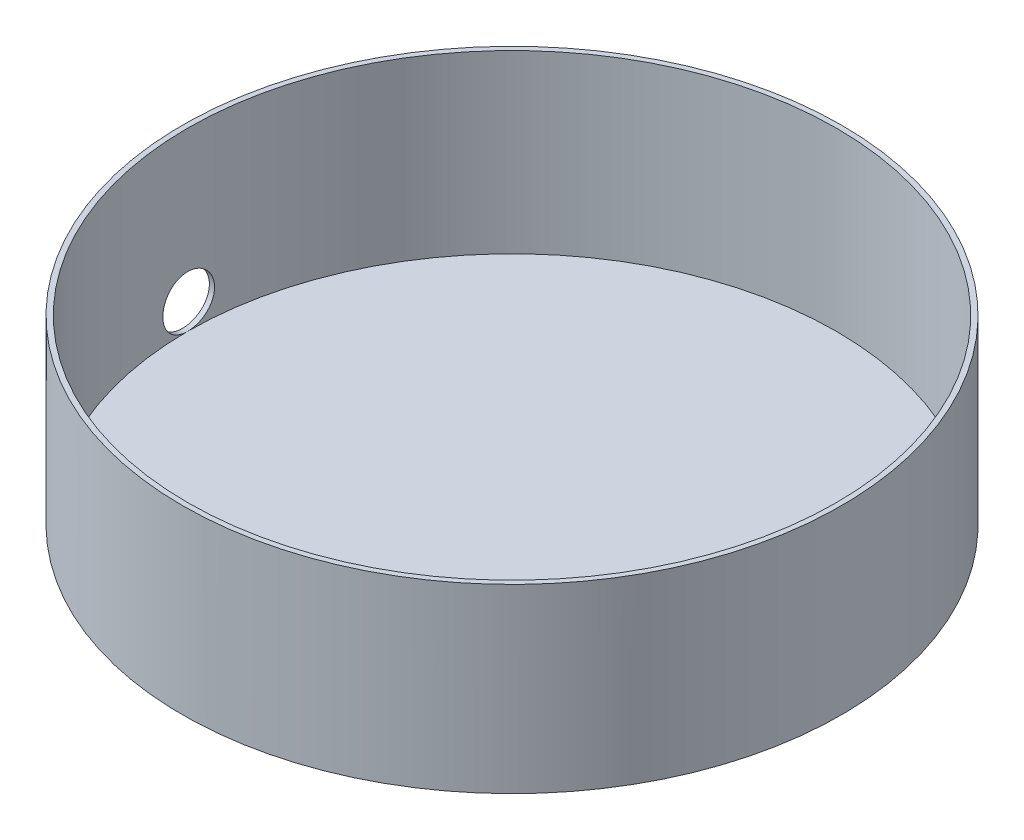
ISO-10303-21;
HEADER;
FILE_DESCRIPTION(('STEP AP214'),'2;1');
FILE_NAME('part.step','',(''),(''),'','','');
FILE_SCHEMA(('AUTOMOTIVE_DESIGN { 1 0 10303 214 1 1 1 1 }'));
ENDSEC;
DATA;
#1=APPLICATION_CONTEXT('core data for automotive mechanical design processes');
#2=APPLICATION_PROTOCOL_DEFINITION('international standard','automotive_design',2000,#1);
#3=PRODUCT_CONTEXT('',#1,'mechanical');
#4=PRODUCT('Part','Part','',(#3));
#5=PRODUCT_RELATED_PRODUCT_CATEGORY('part','',(#4));
#6=PRODUCT_DEFINITION_FORMATION('','',#4);
#7=PRODUCT_DEFINITION_CONTEXT('part definition',#1,'design');
#8=PRODUCT_DEFINITION('design','',#6,#7);
#9=PRODUCT_DEFINITION_SHAPE('','',#8);
#10=(LENGTH_UNIT() NAMED_UNIT(*) SI_UNIT(.MILLI.,.METRE.));
#11=(NAMED_UNIT(*) PLANE_ANGLE_UNIT() SI_UNIT($,.RADIAN.));
#12=(NAMED_UNIT(*) SI_UNIT($,.STERADIAN.) SOLID_ANGLE_UNIT());
#13=UNCERTAINTY_MEASURE_WITH_UNIT(LENGTH_MEASURE(1.E-05),#10,'distance_accuracy_value','');
#14=(GEOMETRIC_REPRESENTATION_CONTEXT(3) GLOBAL_UNCERTAINTY_ASSIGNED_CONTEXT((#13)) GLOBAL_UNIT_ASSIGNED_CONTEXT((#10,
#11,#12)) REPRESENTATION_CONTEXT('',''));
#15=CARTESIAN_POINT('',(0.,0.,0.));
#16=DIRECTION('',(0.,0.,1.));
#17=DIRECTION('',(1.,0.,0.));
#18=AXIS2_PLACEMENT_3D('',#15,#16,#17);
#19=CARTESIAN_POINT('',(0.,68.,0.));
#20=DIRECTION('',(0.,1.,0.));
#21=DIRECTION('',(0.,0.,1.));
#22=AXIS2_PLACEMENT_3D('',#19,#20,#21);
#23=PLANE('',#22);
#24=CARTESIAN_POINT('',(0.,68.,0.));
#25=DIRECTION('',(0.,1.,0.));
#26=DIRECTION('',(0.,0.,1.));
#27=AXIS2_PLACEMENT_3D('',#24,#25,#26);
#28=CIRCLE('',#27,127.3);
#29=CARTESIAN_POINT('',(0.,68.,127.3));
#30=VERTEX_POINT('',#29);
#31=EDGE_CURVE('E11',#30,#30,#28,.T.);
#32=ORIENTED_EDGE('',*,*,#31,.T.);
#33=EDGE_LOOP('',(#32));
#34=FACE_BOUND('',#33,.T.);
#35=CARTESIAN_POINT('',(0.,68.,0.));
#36=DIRECTION('',(0.,1.,0.));
#37=DIRECTION('',(0.,0.,1.));
#38=AXIS2_PLACEMENT_3D('',#35,#36,#37);
#39=CIRCLE('',#38,125.3);
#40=CARTESIAN_POINT('',(0.,68.,125.3));
#41=VERTEX_POINT('',#40);
#42=EDGE_CURVE('E52',#41,#41,#39,.T.);
#43=ORIENTED_EDGE('',*,*,#42,.F.);
#44=EDGE_LOOP('',(#43));
#45=FACE_BOUND('',#44,.T.);
#46=ADVANCED_FACE('F43',(#34,#45),#23,.T.);
#47=CARTESIAN_POINT('',(0.,68.,0.));
#48=DIRECTION('',(0.,-1.,0.));
#49=DIRECTION('',(0.,0.,-1.));
#50=AXIS2_PLACEMENT_3D('',#47,#48,#49);
#51=CYLINDRICAL_SURFACE('',#50,127.3);
#52=CARTESIAN_POINT('',(-127.3,0.,0.));
#53=CARTESIAN_POINT('',(-127.300000530341,-2.46147116870096E-06,-0.2804883389267));
#54=CARTESIAN_POINT('',(-127.299071068691,0.0118056662221252,-0.560938064327831));
#55=CARTESIAN_POINT('',(-127.295380320944,0.0589525418843758,-1.11993123268143));
#56=CARTESIAN_POINT('',(-127.292618579166,0.0942971432839355,-1.39847418401292));
#57=CARTESIAN_POINT('',(-127.285336670805,0.188317148851165,-1.95185429915472));
#58=CARTESIAN_POINT('',(-127.280814734713,0.247016032220201,-2.22668744494222));
#59=CARTESIAN_POINT('',(-127.270140758204,0.387319962759432,-2.77041748137056));
#60=CARTESIAN_POINT('',(-127.263988687067,0.468925441605672,-3.03931426003721));
#61=CARTESIAN_POINT('',(-127.250232566858,0.654400579553155,-3.56910306343837));
#62=CARTESIAN_POINT('',(-127.242629356203,0.758257386850134,-3.82999960989097));
#63=CARTESIAN_POINT('',(-127.226183328113,0.987520390204068,-4.34210972829863));
#64=CARTESIAN_POINT('',(-127.217340492381,1.11292690434775,-4.59332315725799));
#65=CARTESIAN_POINT('',(-127.198666884314,1.38436446268291,-5.08423802896109));
#66=CARTESIAN_POINT('',(-127.188836328074,1.53039099843519,-5.32394197287047));
#67=CARTESIAN_POINT('',(-127.168462965894,1.84205042804856,-5.79020648233313));
#68=CARTESIAN_POINT('',(-127.157920173485,2.00768294948421,-6.01676729742489));
#69=CARTESIAN_POINT('',(-127.136397338422,2.35774257833512,-6.45560542782496));
#70=CARTESIAN_POINT('',(-127.12541645084,2.54220719091612,-6.6678527848723));
#71=CARTESIAN_POINT('',(-127.10334824464,2.92834689435749,-7.07606228366047));
#72=CARTESIAN_POINT('',(-127.09226092579,3.13002202262715,-7.27202439000137));
#73=CARTESIAN_POINT('',(-127.070293266332,3.549168951424,-7.64628807804714));
#74=CARTESIAN_POINT('',(-127.059412934617,3.76664142865402,-7.82458890243067));
#75=CARTESIAN_POINT('',(-127.038168121705,4.2158422442235,-8.16225885838023));
#76=CARTESIAN_POINT('',(-127.027803640598,4.44757058502823,-8.3216279866724));
#77=CARTESIAN_POINT('',(-127.007871847649,4.92395723709767,-8.62049641658756));
#78=CARTESIAN_POINT('',(-126.998305585327,5.16863190113056,-8.75996972433775));
#79=CARTESIAN_POINT('',(-126.980258030158,5.66890248184788,-9.01780358440083));
#80=CARTESIAN_POINT('',(-126.971776738573,5.92449841122743,-9.13616411217094));
#81=CARTESIAN_POINT('',(-126.956141602138,6.4447930722511,-9.35092023166022));
#82=CARTESIAN_POINT('',(-126.948987740475,6.7094916885476,-9.44731610159362));
#83=CARTESIAN_POINT('',(-126.936212215419,7.24610952888727,-9.61744834377333));
#84=CARTESIAN_POINT('',(-126.93059054865,7.51802873702295,-9.69118476593554));
#85=CARTESIAN_POINT('',(-126.921050625843,8.0665746409877,-9.81533396531987));
#86=CARTESIAN_POINT('',(-126.91712885024,8.3431903660546,-9.86579494757646));
#87=CARTESIAN_POINT('',(-126.911083950544,8.89970723508427,-9.9432531457115));
#88=CARTESIAN_POINT('',(-126.908960824217,9.17960837496501,-9.97025039073981));
#89=CARTESIAN_POINT('',(-126.906574060115,9.74069349520314,-10.0005846430903));
#90=CARTESIAN_POINT('',(-126.906310394263,10.0218774561264,-10.0039220076649));
#91=CARTESIAN_POINT('',(-126.907650037963,10.5835234769677,-9.98691313522515));
#92=CARTESIAN_POINT('',(-126.909253345303,10.8639855377404,-9.96656692626558));
#93=CARTESIAN_POINT('',(-126.914275365401,11.4215619948673,-9.90241072399416));
#94=CARTESIAN_POINT('',(-126.917690022226,11.6986824613483,-9.85865315098884));
#95=CARTESIAN_POINT('',(-126.92623490126,12.2482429950959,-9.74802375870885));
#96=CARTESIAN_POINT('',(-126.931365120515,12.5206830704198,-9.68115197922948));
#97=CARTESIAN_POINT('',(-126.94319516267,13.0589547780953,-9.52477526939463));
#98=CARTESIAN_POINT('',(-126.949894995617,13.3247863681328,-9.43527019415901));
#99=CARTESIAN_POINT('',(-126.964673929589,13.8479615343085,-9.23426883410909));
#100=CARTESIAN_POINT('',(-126.972753032913,14.1053050962968,-9.1227725126363));
#101=CARTESIAN_POINT('',(-126.990071079357,14.6099706410519,-8.87844880477855));
#102=CARTESIAN_POINT('',(-126.99931129835,14.857281197594,-8.745597907747));
#103=CARTESIAN_POINT('',(-127.018682564477,15.3398363409034,-8.45959880446963));
#104=CARTESIAN_POINT('',(-127.028813612037,15.5750809218866,-8.30645058849382));
#105=CARTESIAN_POINT('',(-127.049680047034,16.0318540643056,-7.98093901900111));
#106=CARTESIAN_POINT('',(-127.060415443621,16.2533824179582,-7.80857537450601));
#107=CARTESIAN_POINT('',(-127.082187209618,16.6811637032347,-7.44585075821804));
#108=CARTESIAN_POINT('',(-127.0932235796,16.8874166057831,-7.25548975217039));
#109=CARTESIAN_POINT('',(-127.115315925835,17.28373570574,-6.85756954556159));
#110=CARTESIAN_POINT('',(-127.126371873928,17.4737564193494,-6.64996503963118));
#111=CARTESIAN_POINT('',(-127.148159992779,17.8356379524948,-6.21947333068422));
#112=CARTESIAN_POINT('',(-127.158892162912,18.0074987369989,-5.99658609818747));
#113=CARTESIAN_POINT('',(-127.17972862755,18.3318410736133,-5.5371025812139));
#114=CARTESIAN_POINT('',(-127.189832920963,18.4843225920151,-5.30050627289248));
#115=CARTESIAN_POINT('',(-127.209127213489,18.7688196577338,-4.81527755783105));
#116=CARTESIAN_POINT('',(-127.218317213353,18.9008352218731,-4.56664516098455));
#117=CARTESIAN_POINT('',(-127.235523088632,19.1434670486393,-4.05908121834311));
#118=CARTESIAN_POINT('',(-127.24353885412,19.254081308095,-3.80014871118548));
#119=CARTESIAN_POINT('',(-127.258167640808,19.4530993675286,-3.27384529288127));
#120=CARTESIAN_POINT('',(-127.264780661484,19.5415031592222,-3.00647437858726));
#121=CARTESIAN_POINT('',(-127.276415904668,19.6954599402489,-2.46520276006297));
#122=CARTESIAN_POINT('',(-127.281438151171,19.7610132742516,-2.19130215439117));
#123=CARTESIAN_POINT('',(-127.289749083348,19.8687949263512,-1.63892368849953));
#124=CARTESIAN_POINT('',(-127.29303777299,19.9110232978449,-1.36044583875968));
#125=CARTESIAN_POINT('',(-127.297781658994,19.971766723816,-0.80165071631545));
#126=CARTESIAN_POINT('',(-127.299241711019,19.9903445807398,-0.521340310241279));
#127=CARTESIAN_POINT('',(-127.300303005908,20.0038588309048,0.0398530998409086));
#128=CARTESIAN_POINT('',(-127.299904252052,19.9987952658603,0.320736102837733));
#129=CARTESIAN_POINT('',(-127.297259247781,19.9650636336345,0.881069971813325));
#130=CARTESIAN_POINT('',(-127.295013012072,19.9363957543674,1.16052084917544));
#131=CARTESIAN_POINT('',(-127.288736699213,19.8556636902225,1.71600186789409));
#132=CARTESIAN_POINT('',(-127.284706622377,19.8035995094909,1.99203200985684));
#133=CARTESIAN_POINT('',(-127.274982900296,19.6765321610074,2.53836203758807));
#134=CARTESIAN_POINT('',(-127.269291366094,19.6015580968792,2.80866873096353));
#135=CARTESIAN_POINT('',(-127.256403398484,19.4291879576136,3.34199827428123));
#136=CARTESIAN_POINT('',(-127.249206966802,19.3317919081986,3.60502113257902));
#137=CARTESIAN_POINT('',(-127.233511958051,19.1152737478056,4.1219296685525));
#138=CARTESIAN_POINT('',(-127.225013366749,18.9961513993857,4.37581524633253));
#139=CARTESIAN_POINT('',(-127.206953398615,18.7370297052805,4.87265965005499));
#140=CARTESIAN_POINT('',(-127.197392019481,18.5970303143808,5.11561845233131));
#141=CARTESIAN_POINT('',(-127.177454629492,18.2968327057625,5.58939871719498));
#142=CARTESIAN_POINT('',(-127.167076955242,18.1365928187104,5.82019370766891));
#143=CARTESIAN_POINT('',(-127.145817558459,17.7972804058415,6.26747290189255));
#144=CARTESIAN_POINT('',(-127.134935835297,17.6182078565965,6.48395708783884));
#145=CARTESIAN_POINT('',(-127.112975465189,17.2424920080925,6.90109425803375));
#146=CARTESIAN_POINT('',(-127.101896815545,17.0458484681352,7.1017470253429));
#147=CARTESIAN_POINT('',(-127.079855713765,16.636377917601,7.48580524121175));
#148=CARTESIAN_POINT('',(-127.068893261762,16.423550888216,7.66921066972641));
#149=CARTESIAN_POINT('',(-127.047370814629,15.9827244724812,8.01786464903414));
#150=CARTESIAN_POINT('',(-127.036811761256,15.7546926330056,8.18307222841819));
#151=CARTESIAN_POINT('',(-127.016422087824,15.2854898461926,8.49368917258544));
#152=CARTESIAN_POINT('',(-127.006591469009,15.0443188764363,8.639098503586));
#153=CARTESIAN_POINT('',(-126.98793888477,14.5505469002336,8.90907948524558));
#154=CARTESIAN_POINT('',(-126.979116912718,14.2979459689145,9.03365127284123));
#155=CARTESIAN_POINT('',(-126.96273349064,13.783105093906,9.26106418600341));
#156=CARTESIAN_POINT('',(-126.955172038483,13.5208651665164,9.36390534831503));
#157=CARTESIAN_POINT('',(-126.941533682762,12.9889102678711,9.54701276513106));
#158=CARTESIAN_POINT('',(-126.935455124561,12.7192040054623,9.62730419626644));
#159=CARTESIAN_POINT('',(-126.924945503927,12.1739552250015,9.7648847659247));
#160=CARTESIAN_POINT('',(-126.920514440678,11.8984127098374,9.82217391582909));
#161=CARTESIAN_POINT('',(-126.913426850067,11.3434618470999,9.91333340871433));
#162=CARTESIAN_POINT('',(-126.910770297884,11.0640535536561,9.94720407926824));
#163=CARTESIAN_POINT('',(-126.907307864738,10.5033653963323,9.99128126529139));
#164=CARTESIAN_POINT('',(-126.906501980222,10.222085536048,10.001487826211));
#165=CARTESIAN_POINT('',(-126.906763634057,9.66043101839599,9.99816712631253));
#166=CARTESIAN_POINT('',(-126.907826094035,9.38005597610451,9.98470420188366));
#167=CARTESIAN_POINT('',(-126.911784275996,8.82144231630684,9.93426644440732));
#168=CARTESIAN_POINT('',(-126.914679994432,8.54320369466766,9.89729165685602));
#169=CARTESIAN_POINT('',(-126.92222206811,7.99084070041981,9.8000978083697));
#170=CARTESIAN_POINT('',(-126.926868424082,7.7167163295272,9.73987873773981));
#171=CARTESIAN_POINT('',(-126.937779365268,7.17452675624462,9.59663084365379));
#172=CARTESIAN_POINT('',(-126.944043951831,6.90646155890465,9.51360200118775));
#173=CARTESIAN_POINT('',(-126.958012810952,6.37829992183104,9.32533564480319));
#174=CARTESIAN_POINT('',(-126.965717017237,6.11820311591245,9.22009915318874));
#175=CARTESIAN_POINT('',(-126.982346594012,5.60780075756112,8.98816787303389));
#176=CARTESIAN_POINT('',(-126.991271964298,5.35749520349152,8.86147308808084));
#177=CARTESIAN_POINT('',(-127.01009083714,4.86844195236084,8.58752962034627));
#178=CARTESIAN_POINT('',(-127.019984319092,4.62969400948102,8.44028137497506));
#179=CARTESIAN_POINT('',(-127.040459909647,4.16542662023127,8.12627162488893));
#180=CARTESIAN_POINT('',(-127.051042019147,3.93990719108366,7.95951009477035));
#181=CARTESIAN_POINT('',(-127.072624035977,3.50311667341525,7.60719639218516));
#182=CARTESIAN_POINT('',(-127.083624948637,3.29188375554998,7.4215969560213));
#183=CARTESIAN_POINT('',(-127.105707488205,2.88578920888874,7.03327334163429));
#184=CARTESIAN_POINT('',(-127.116789116938,2.69092795132703,6.83054877530055));
#185=CARTESIAN_POINT('',(-127.138721899539,2.31891253533949,6.40935748453391));
#186=CARTESIAN_POINT('',(-127.149572997502,2.14176263436073,6.19088699671923));
#187=CARTESIAN_POINT('',(-127.170734722323,1.80647986979352,5.73979116064327));
#188=CARTESIAN_POINT('',(-127.181045357186,1.64834672452819,5.50716602211808));
#189=CARTESIAN_POINT('',(-127.200851558475,1.3519627338155,5.02898705749904));
#190=CARTESIAN_POINT('',(-127.210345690976,1.21374658987422,4.78341166080938));
#191=CARTESIAN_POINT('',(-127.228229013019,0.958513861986229,4.28144920980636));
#192=CARTESIAN_POINT('',(-127.236618223383,0.841496878554302,4.02506235934049));
#193=CARTESIAN_POINT('',(-127.252045396899,0.629609177367675,3.50355566194364));
#194=CARTESIAN_POINT('',(-127.259084733258,0.534715932044366,3.23844501481806));
#195=CARTESIAN_POINT('',(-127.271621371847,0.367631061101514,2.70122245258774));
#196=CARTESIAN_POINT('',(-127.277119062952,0.295433709961575,2.42911232202025));
#197=CARTESIAN_POINT('',(-127.28774841706,0.156878426495209,1.80105927349939));
#198=CARTESIAN_POINT('',(-127.292325190085,0.0981029612136706,1.44340827356223));
#199=CARTESIAN_POINT('',(-127.298450635938,0.0196653810674359,0.723816751396403));
#200=CARTESIAN_POINT('',(-127.299999315772,3.17570395385827E-06,0.361876239094606));
#201=CARTESIAN_POINT('',(-127.3,0.,0.));
#202=B_SPLINE_CURVE_WITH_KNOTS('',3,(#52,#53,#54,#55,#56,#57,#58,#59,#60,#61,#62,#63,#64,#65,
#66,#67,#68,#69,#70,#71,#72,#73,#74,#75,#76,#77,#78,#79,#80,#81,#82,#83,#84,#85,#86,#87,#88,#89,
#90,#91,#92,#93,#94,#95,#96,#97,#98,#99,#100,#101,#102,#103,#104,#105,#106,#107,#108,#109,#110,
#111,#112,#113,#114,#115,#116,#117,#118,#119,#120,#121,#122,#123,#124,#125,#126,#127,#128,#129,
#130,#131,#132,#133,#134,#135,#136,#137,#138,#139,#140,#141,#142,#143,#144,#145,#146,#147,#148,
#149,#150,#151,#152,#153,#154,#155,#156,#157,#158,#159,#160,#161,#162,#163,#164,#165,#166,#167,
#168,#169,#170,#171,#172,#173,#174,#175,#176,#177,#178,#179,#180,#181,#182,#183,#184,#185,#186,
#187,#188,#189,#190,#191,#192,#193,#194,#195,#196,#197,#198,#199,#200,#201),.UNSPECIFIED.,.T.,
.F.,(4,2,2,2,2,2,2,2,2,2,2,2,2,2,2,2,2,2,2,2,2,2,2,2,2,2,2,2,2,2,2,2,2,2,2,2,2,2,2,2,2,2,2,2,2,
2,2,2,2,2,2,2,2,2,2,2,2,2,2,2,2,2,2,2,2,2,2,2,2,2,2,2,2,2,4),(0.,0.841148700120982,
1.68250666885709,2.52471264194659,3.36693448751945,4.2086711921504,5.05042032239253,
5.89198569358775,6.73353508139591,7.57679442640033,8.42005560438479,9.26335292603543,
10.1066503935174,10.951039730868,11.7954300497822,12.6398096726744,13.4841874354916,
14.3268084939317,15.1694285055514,16.012035793996,16.8546420843117,17.6953695454773,
18.5360955591849,19.37682695468,20.2175597516509,21.0592245872464,21.9008898263143,
22.7425678124049,23.5842474005115,24.4282129539623,25.2721801354595,26.116148784938,
26.960116740696,27.804163654039,28.6482108822067,29.4922453784691,30.3362779425114,
31.1780645242019,32.0198496206012,32.8616280156034,33.7034062614261,34.5441195668904,
35.3848319079,36.2255534374217,37.0662767877593,37.9087600497164,38.7512443597493,
39.5937402124231,40.4362370442428,41.2805935259729,42.1249514484481,42.9693038218973,
43.8136547675904,44.6570592187834,45.5004632526599,46.343855488929,47.1872461053377,
48.028347831686,48.8694479304822,49.7105483800905,50.5516495306839,51.3927119705785,
52.2337742698665,53.07481867274,53.9158641705529,54.7590745878768,55.6023041201933,
56.4457358627118,57.289155110749,58.1340265316835,58.9788820298762,59.8228734568437,
60.6666517979027,61.7518749254538,62.8370955420536),.UNSPECIFIED.);
#203=CARTESIAN_POINT('',(-127.3,0.,0.));
#204=VERTEX_POINT('',#203);
#205=EDGE_CURVE('E63',#204,#204,#202,.T.);
#206=ORIENTED_EDGE('',*,*,#205,.T.);
#207=EDGE_LOOP('',(#206));
#208=FACE_BOUND('',#207,.T.);
#209=ORIENTED_EDGE('',*,*,#31,.F.);
#210=EDGE_LOOP('',(#209));
#211=FACE_BOUND('',#210,.T.);
#212=CARTESIAN_POINT('',(0.,-2.,0.));
#213=DIRECTION('',(0.,-1.,0.));
#214=DIRECTION('',(0.,0.,-1.));
#215=AXIS2_PLACEMENT_3D('',#212,#213,#214);
#216=CIRCLE('',#215,127.3);
#217=CARTESIAN_POINT('',(0.,-2.,-127.3));
#218=VERTEX_POINT('',#217);
#219=EDGE_CURVE('E67',#218,#218,#216,.T.);
#220=ORIENTED_EDGE('',*,*,#219,.F.);
#221=EDGE_LOOP('',(#220));
#222=FACE_BOUND('',#221,.T.);
#223=ADVANCED_FACE('F45',(#208,#211,#222),#51,.T.);
#224=CARTESIAN_POINT('',(0.,68.,0.));
#225=DIRECTION('',(0.,-1.,0.));
#226=DIRECTION('',(0.,0.,-1.));
#227=AXIS2_PLACEMENT_3D('',#224,#225,#226);
#228=CYLINDRICAL_SURFACE('',#227,125.3);
#229=ORIENTED_EDGE('',*,*,#42,.T.);
#230=EDGE_LOOP('',(#229));
#231=FACE_BOUND('',#230,.T.);
#232=CARTESIAN_POINT('',(0.,0.,0.));
#233=DIRECTION('',(0.,1.,0.));
#234=DIRECTION('',(0.,0.,1.));
#235=AXIS2_PLACEMENT_3D('',#232,#233,#234);
#236=CIRCLE('',#235,125.3);
#237=CARTESIAN_POINT('',(-125.3,0.,0.));
#238=VERTEX_POINT('',#237);
#239=EDGE_CURVE('E106',#238,#238,#236,.T.);
#240=ORIENTED_EDGE('',*,*,#239,.F.);
#241=CARTESIAN_POINT('',(-125.3,0.,0.));
#242=CARTESIAN_POINT('',(-125.300000541806,-2.47636605920631E-06,-0.280473413921286));
#243=CARTESIAN_POINT('',(-125.299056343452,0.0118044018944614,-0.560908035947152));
#244=CARTESIAN_POINT('',(-125.295307085137,0.0589461844828409,-1.11987089149806));
#245=CARTESIAN_POINT('',(-125.292501563133,0.0942869307234006,-1.39839863432229));
#246=CARTESIAN_POINT('',(-125.285104219376,0.188296413144094,-1.95174770667112));
#247=CARTESIAN_POINT('',(-125.280510603397,0.246988582149526,-2.22656502554759));
#248=CARTESIAN_POINT('',(-125.269667414153,0.387276094223371,-2.77026350614548));
#249=CARTESIAN_POINT('',(-125.263417809622,0.468871869748427,-3.03914455567724));
#250=CARTESIAN_POINT('',(-125.249443589025,0.654324212483509,-3.56890159087915));
#251=CARTESIAN_POINT('',(-125.241719828505,0.758167872114536,-3.82978211832177));
#252=CARTESIAN_POINT('',(-125.225012988034,0.987401219447137,-4.34186105848578));
#253=CARTESIAN_POINT('',(-125.216029889535,1.11279122447132,-4.59305932854555));
#254=CARTESIAN_POINT('',(-125.197059976455,1.38419257189354,-5.08394556857459));
#255=CARTESIAN_POINT('',(-125.187073380525,1.53019942488802,-5.32363602923053));
#256=CARTESIAN_POINT('',(-125.166376479639,1.84181642547756,-5.7898757073685));
#257=CARTESIAN_POINT('',(-125.155666188379,2.00742620218151,-6.01642517335986));
#258=CARTESIAN_POINT('',(-125.133800524977,2.35744835085647,-6.45525685438828));
#259=CARTESIAN_POINT('',(-125.122644268109,2.54189935533067,-6.66750821214886));
#260=CARTESIAN_POINT('',(-125.100223357488,2.92801176758441,-7.07572711378567));
#261=CARTESIAN_POINT('',(-125.088958703495,3.12967321340982,-7.27169462166248));
#262=CARTESIAN_POINT('',(-125.066639390771,3.54879318329664,-7.6459708276112));
#263=CARTESIAN_POINT('',(-125.05558474109,3.76625238624,-7.82427876601382));
#264=CARTESIAN_POINT('',(-125.033999242648,4.2154275498893,-8.16196478406271));
#265=CARTESIAN_POINT('',(-125.023468393984,4.44714351324092,-8.32134286019607));
#266=CARTESIAN_POINT('',(-125.003215897007,4.92351701441472,-8.6202374238825));
#267=CARTESIAN_POINT('',(-124.993495349936,5.16819144852636,-8.75972705905808));
#268=CARTESIAN_POINT('',(-124.975156441034,5.66846428240258,-9.01759337475541));
#269=CARTESIAN_POINT('',(-124.966538080525,5.92406269527146,-9.13597002994934));
#270=CARTESIAN_POINT('',(-124.950649996394,6.44436499683862,-9.3507577526922));
#271=CARTESIAN_POINT('',(-124.94338025522,6.7090687669839,-9.44716910610785));
#272=CARTESIAN_POINT('',(-124.930397533377,7.24569952997129,-9.61733124550128));
#273=CARTESIAN_POINT('',(-124.924684549166,7.51762650638401,-9.69108208301625));
#274=CARTESIAN_POINT('',(-124.914989714343,8.06617190583047,-9.81525442337701));
#275=CARTESIAN_POINT('',(-124.911004173094,8.34277900207142,-9.86572567740477));
#276=CARTESIAN_POINT('',(-124.904860491375,8.89928008954721,-9.94320569068973));
#277=CARTESIAN_POINT('',(-124.902702348561,9.17917407656728,-9.97021448002942));
#278=CARTESIAN_POINT('',(-124.900275322818,9.74024602495597,-10.0005728625624));
#279=CARTESIAN_POINT('',(-124.90000641055,10.0214239663189,-10.0039228231419));
#280=CARTESIAN_POINT('',(-124.901365482327,10.5830589215993,-9.98694010065941));
#281=CARTESIAN_POINT('',(-124.902993464051,10.8635159363984,-9.96660744656786));
#282=CARTESIAN_POINT('',(-124.90809375921,11.4210628132315,-9.90248162044268));
#283=CARTESIAN_POINT('',(-124.91156181809,11.6981589405624,-9.85874256578709));
#284=CARTESIAN_POINT('',(-124.92024076717,12.2476721504019,-9.74815461356234));
#285=CARTESIAN_POINT('',(-124.925451654271,12.5200892412266,-9.68130575707125));
#286=CARTESIAN_POINT('',(-124.937467991822,13.0583167685577,-9.52497931813337));
#287=CARTESIAN_POINT('',(-124.944273452749,13.3241271616448,-9.43550158701283));
#288=CARTESIAN_POINT('',(-124.959285596635,13.8472622119283,-9.23455932484828));
#289=CARTESIAN_POINT('',(-124.967492282006,14.104586854527,-9.1230947559839));
#290=CARTESIAN_POINT('',(-124.985084301725,14.609226372201,-8.87883456152231));
#291=CARTESIAN_POINT('',(-124.994470973567,14.8565294606183,-8.74601468163146));
#292=CARTESIAN_POINT('',(-125.014149474738,15.3390724570442,-8.46008021339215));
#293=CARTESIAN_POINT('',(-125.024441304514,15.5743123590887,-8.30696561501023));
#294=CARTESIAN_POINT('',(-125.04563912266,16.0310796879491,-7.98152343200021));
#295=CARTESIAN_POINT('',(-125.056545120635,16.2526069002127,-7.80919554687431));
#296=CARTESIAN_POINT('',(-125.078663132004,16.6803899524222,-7.44654410775193));
#297=CARTESIAN_POINT('',(-125.089875146,16.8866457623647,-7.25622051840127));
#298=CARTESIAN_POINT('',(-125.112320393117,17.28299265805,-6.85835874030264));
#299=CARTESIAN_POINT('',(-125.123553597595,17.473036800915,-6.6507737825818));
#300=CARTESIAN_POINT('',(-125.145691371856,17.8349669088554,-6.22031872822147));
#301=CARTESIAN_POINT('',(-125.156595940985,18.0068528377747,-5.99744860114795));
#302=CARTESIAN_POINT('',(-125.177767479846,18.331247087402,-5.53799637661298));
#303=CARTESIAN_POINT('',(-125.188034448431,18.4837553732497,-5.30141425448493));
#304=CARTESIAN_POINT('',(-125.207639770166,18.7683073261839,-4.8162105959832));
#305=CARTESIAN_POINT('',(-125.216978124104,18.9003510106174,-4.5675890698151));
#306=CARTESIAN_POINT('',(-125.234462234688,19.1430405163563,-4.06004225083365));
#307=CARTESIAN_POINT('',(-125.242607874991,19.2536842505582,-3.80111595597874));
#308=CARTESIAN_POINT('',(-125.257474189077,19.4527615397154,-3.27482114772387));
#309=CARTESIAN_POINT('',(-125.264194862311,19.5411950861051,-3.00745263106812));
#310=CARTESIAN_POINT('',(-125.276020116315,19.6952110620682,-2.46618222180256));
#311=CARTESIAN_POINT('',(-125.281124722246,19.7607938473964,-2.19228043097771));
#312=CARTESIAN_POINT('',(-125.289572731372,19.8686336122203,-1.63989618390466));
#313=CARTESIAN_POINT('',(-125.29291613873,19.9108906468452,-1.3614137384842));
#314=CARTESIAN_POINT('',(-125.297739939874,19.9716875034284,-0.802630321505274));
#315=CARTESIAN_POINT('',(-125.299225424593,19.9902921381363,-0.522336444080249));
#316=CARTESIAN_POINT('',(-125.30030813044,20.0038624576544,0.038826361844468));
#317=CARTESIAN_POINT('',(-125.299905355006,19.9988281855099,0.31969528929609));
#318=CARTESIAN_POINT('',(-125.297222967097,19.9651574707405,0.880003304948488));
#319=CARTESIAN_POINT('',(-125.294943370049,19.9365212221142,1.15944240488287));
#320=CARTESIAN_POINT('',(-125.288571936089,19.8558546630945,1.71490218451709));
#321=CARTESIAN_POINT('',(-125.284480099511,19.8038243569989,1.99092286484494));
#322=CARTESIAN_POINT('',(-125.274606499538,19.6768295686445,2.53722496431411));
#323=CARTESIAN_POINT('',(-125.268826951229,19.6018951415592,2.80751341127079));
#324=CARTESIAN_POINT('',(-125.255738957412,19.4296083122608,3.34080963548249));
#325=CARTESIAN_POINT('',(-125.248430513716,19.3322559366046,3.60381742136191));
#326=CARTESIAN_POINT('',(-125.232490589372,19.1158289662421,4.12069961321042));
#327=CARTESIAN_POINT('',(-125.223859093814,18.9967541267329,4.37457391621045));
#328=CARTESIAN_POINT('',(-125.20551610764,18.7377310304562,4.87140013790852));
#329=CARTESIAN_POINT('',(-125.195804614611,18.5977827270548,5.11435203220303));
#330=CARTESIAN_POINT('',(-125.17555293544,18.2976806141969,5.58813921281017));
#331=CARTESIAN_POINT('',(-125.165011005057,18.137483824381,5.81894720084718));
#332=CARTESIAN_POINT('',(-125.143414457864,17.7982576935442,6.26625624278078));
#333=CARTESIAN_POINT('',(-125.132359840398,17.6192283283613,6.48275727832127));
#334=CARTESIAN_POINT('',(-125.110049864451,17.2435982769165,6.89993248500585));
#335=CARTESIAN_POINT('',(-125.098794503134,17.0469973422743,7.10060643235303));
#336=CARTESIAN_POINT('',(-125.076401109166,16.6376107870075,7.48471153977208));
#337=CARTESIAN_POINT('',(-125.065263076655,16.4248251469479,7.66814267913763));
#338=CARTESIAN_POINT('',(-125.043394356025,15.984063722504,8.01686536780931));
#339=CARTESIAN_POINT('',(-125.032664654244,15.7560544202586,8.18211461800973));
#340=CARTESIAN_POINT('',(-125.011944701538,15.2868921015834,8.49281662969677));
#341=CARTESIAN_POINT('',(-125.001954451916,15.0457390619987,8.63826935630674));
#342=CARTESIAN_POINT('',(-124.98299820995,14.5519980145656,8.90833837878464));
#343=CARTESIAN_POINT('',(-124.974032210703,14.2994100838087,9.03295481509952));
#344=CARTESIAN_POINT('',(-124.957380496471,13.7845900276568,9.26045772050541));
#345=CARTESIAN_POINT('',(-124.949694779252,13.5223579190866,9.36334422750374));
#346=CARTESIAN_POINT('',(-124.93583163103,12.9904225512842,9.54653918436744));
#347=CARTESIAN_POINT('',(-124.929652467903,12.7207282727085,9.62687357920908));
#348=CARTESIAN_POINT('',(-124.918967779036,12.1754987744664,9.76454103402924));
#349=CARTESIAN_POINT('',(-124.914462252442,11.8999635577761,9.82187410572725));
#350=CARTESIAN_POINT('',(-124.907254053254,11.3450229401542,9.91312178047137));
#351=CARTESIAN_POINT('',(-124.904551354513,11.0656175954124,9.94703672315775));
#352=CARTESIAN_POINT('',(-124.901026292425,10.5049311998645,9.9912023285152));
#353=CARTESIAN_POINT('',(-124.900203925348,10.2236501527809,10.0014530381367));
#354=CARTESIAN_POINT('',(-124.900462751103,9.66201431966209,9.99822015932619));
#355=CARTESIAN_POINT('',(-124.901538616934,9.38165914653003,9.98480298997819));
#356=CARTESIAN_POINT('',(-124.905552868174,8.8230814719491,9.93446014280517));
#357=CARTESIAN_POINT('',(-124.908491249863,8.544858966241,9.89753451194214));
#358=CARTESIAN_POINT('',(-124.916146675836,7.99252435680391,9.80044217980168));
#359=CARTESIAN_POINT('',(-124.920863720759,7.71841225455316,9.74027547016623));
#360=CARTESIAN_POINT('',(-124.931942033833,7.1762431498354,9.59713533273244));
#361=CARTESIAN_POINT('',(-124.938303303397,6.90818615257309,9.51416188533121));
#362=CARTESIAN_POINT('',(-124.952488725124,6.38003758170748,9.32600954061655));
#363=CARTESIAN_POINT('',(-124.960312804142,6.11994561058423,9.22083175355611));
#364=CARTESIAN_POINT('',(-124.977201938668,5.60954800765795,8.98902063984081));
#365=CARTESIAN_POINT('',(-124.986266993952,5.35924237409148,8.86238731705213));
#366=CARTESIAN_POINT('',(-125.005381111577,4.8701833329998,8.58856904604713));
#367=CARTESIAN_POINT('',(-125.015430153523,4.63142968620208,8.44138452374667));
#368=CARTESIAN_POINT('',(-125.03622837768,4.16714477040077,8.12750396630392));
#369=CARTESIAN_POINT('',(-125.046977560854,3.94161351959336,7.96080790431151));
#370=CARTESIAN_POINT('',(-125.068901967069,3.50477375651008,7.60861110001357));
#371=CARTESIAN_POINT('',(-125.080078247468,3.29350467870613,7.42306150950852));
#372=CARTESIAN_POINT('',(-125.102513541424,2.88733347266849,7.034834803633));
#373=CARTESIAN_POINT('',(-125.113772556854,2.69243171629566,6.83215729933102));
#374=CARTESIAN_POINT('',(-125.136057178842,2.32033095554738,6.41105670912911));
#375=CARTESIAN_POINT('',(-125.147082728825,2.14313620417942,6.19262986201289));
#376=CARTESIAN_POINT('',(-125.168585477081,1.80775947912873,5.74161710342023));
#377=CARTESIAN_POINT('',(-125.179062683457,1.64957722446688,5.50903140126919));
#378=CARTESIAN_POINT('',(-125.199190160385,1.35308482981184,5.03091655872441));
#379=CARTESIAN_POINT('',(-125.208838940283,1.21481022075035,4.78536531915413));
#380=CARTESIAN_POINT('',(-125.227014487031,0.959458886444069,4.28344486395123));
#381=CARTESIAN_POINT('',(-125.235541275062,0.842381760989069,4.02707585267171));
#382=CARTESIAN_POINT('',(-125.251222500358,0.630372727690864,3.50559790001647));
#383=CARTESIAN_POINT('',(-125.258378330417,0.53541832332785,3.24049815286821));
#384=CARTESIAN_POINT('',(-125.271123669086,0.368211023438226,2.70329086322374));
#385=CARTESIAN_POINT('',(-125.276713572163,0.295952410156562,2.4311851044741));
#386=CARTESIAN_POINT('',(-125.287528654047,0.157185141844029,1.80280540463242));
#387=CARTESIAN_POINT('',(-125.292187488727,0.0982948972081859,1.44481315536988));
#388=CARTESIAN_POINT('',(-125.298422808134,0.0197039724268917,0.724525696025787));
#389=CARTESIAN_POINT('',(-125.299999300259,3.19821866194728E-06,0.362230496274294));
#390=CARTESIAN_POINT('',(-125.3,0.,0.));
#391=B_SPLINE_CURVE_WITH_KNOTS('',3,(#241,#242,#243,#244,#245,#246,#247,#248,#249,#250,#251,
#252,#253,#254,#255,#256,#257,#258,#259,#260,#261,#262,#263,#264,#265,#266,#267,#268,#269,#270,
#271,#272,#273,#274,#275,#276,#277,#278,#279,#280,#281,#282,#283,#284,#285,#286,#287,#288,#289,
#290,#291,#292,#293,#294,#295,#296,#297,#298,#299,#300,#301,#302,#303,#304,#305,#306,#307,#308,
#309,#310,#311,#312,#313,#314,#315,#316,#317,#318,#319,#320,#321,#322,#323,#324,#325,#326,#327,
#328,#329,#330,#331,#332,#333,#334,#335,#336,#337,#338,#339,#340,#341,#342,#343,#344,#345,#346,
#347,#348,#349,#350,#351,#352,#353,#354,#355,#356,#357,#358,#359,#360,#361,#362,#363,#364,#365,
#366,#367,#368,#369,#370,#371,#372,#373,#374,#375,#376,#377,#378,#379,#380,#381,#382,#383,#384,
#385,#386,#387,#388,#389,#390),.UNSPECIFIED.,.T.,.F.,(4,2,2,2,2,2,2,2,2,2,2,2,2,2,2,2,2,2,2,2,2,
2,2,2,2,2,2,2,2,2,2,2,2,2,2,2,2,2,2,2,2,2,2,2,2,2,2,2,2,2,2,2,2,2,2,2,2,2,2,2,2,2,2,2,2,2,2,2,2,
2,2,2,2,2,4),(0.,0.841103608129624,1.68241608487544,2.52457494489053,3.36674970727862,
4.2084371810028,5.05013705169516,5.89165392061145,6.73315487041045,7.57641727452071,
8.41968154281837,9.26298207043583,10.1062827545479,10.9507114526823,11.7951411638142,
12.6395598845141,13.4839766847242,14.326580409673,15.1691830542727,16.0117726144846,
16.8543611439739,17.6950099087908,18.5356571793484,19.3763099731781,20.2169642130582,
21.0585800593759,21.9001963217794,22.7418257489957,23.5834568297036,24.4274476166778,
25.2714400841557,26.1154340699451,26.9594273403094,27.8035028825516,28.6475787503199,
29.4916414764103,30.3357022075951,31.1774450069977,32.0191862736259,32.8609206215541,
33.7026548148448,34.5432891780798,35.3839225454875,36.2245653870607,37.0652101067586,
37.9076701648268,38.7501313037674,39.5926043530743,40.4350784140659,41.2794727517164,
42.1238685769653,42.9682587103377,43.8126473706802,44.6560605892586,45.4994733781056,
46.3428739344225,47.1862728174094,48.0273086370265,48.8683427765425,49.709377218514,
50.5504123833753,51.3914055050703,52.2323984752226,53.073374018699,53.914350719468,
54.7575647573478,55.6007979476287,56.4442331879139,57.2876559618278,58.1325658856263,
58.977459855793,59.8214908691476,60.6653090747333,61.7515942395644,62.8378767970848),.UNSPECIFIED.);
#392=EDGE_CURVE('E56',#238,#238,#391,.T.);
#393=ORIENTED_EDGE('',*,*,#392,.F.);
#394=EDGE_LOOP('',(#240,#393));
#395=FACE_BOUND('',#394,.T.);
#396=ADVANCED_FACE('F78',(#231,#395),#228,.F.);
#397=CARTESIAN_POINT('',(0.,0.,0.));
#398=DIRECTION('',(0.,-1.,0.));
#399=DIRECTION('',(0.,0.,-1.));
#400=AXIS2_PLACEMENT_3D('',#397,#398,#399);
#401=PLANE('',#400);
#402=ORIENTED_EDGE('',*,*,#239,.T.);
#403=EDGE_LOOP('',(#402));
#404=FACE_BOUND('',#403,.T.);
#405=ADVANCED_FACE('F87',(#404),#401,.F.);
#406=CARTESIAN_POINT('',(0.,-2.,0.));
#407=DIRECTION('',(0.,-1.,0.));
#408=DIRECTION('',(0.,0.,-1.));
#409=AXIS2_PLACEMENT_3D('',#406,#407,#408);
#410=PLANE('',#409);
#411=ORIENTED_EDGE('',*,*,#219,.T.);
#412=EDGE_LOOP('',(#411));
#413=FACE_BOUND('',#412,.T.);
#414=ADVANCED_FACE('F84',(#413),#410,.T.);
#415=CARTESIAN_POINT('',(-127.3,10.,0.));
#416=DIRECTION('',(1.,0.,0.));
#417=DIRECTION('',(0.,0.,-1.));
#418=AXIS2_PLACEMENT_3D('',#415,#416,#417);
#419=CYLINDRICAL_SURFACE('',#418,10.);
#420=ORIENTED_EDGE('',*,*,#392,.T.);
#421=EDGE_LOOP('',(#420));
#422=FACE_BOUND('',#421,.T.);
#423=ORIENTED_EDGE('',*,*,#205,.F.);
#424=EDGE_LOOP('',(#423));
#425=FACE_BOUND('',#424,.T.);
#426=ADVANCED_FACE('F57',(#422,#425),#419,.F.);
#427=CLOSED_SHELL('',(#46,#223,#396,#405,#414,#426));
#428=MANIFOLD_SOLID_BREP('B2',#427);
#429=ADVANCED_BREP_SHAPE_REPRESENTATION('',(#18,#428),#14);
#430=SHAPE_DEFINITION_REPRESENTATION(#9,#429);
ENDSEC;
END-ISO-10303-21;
